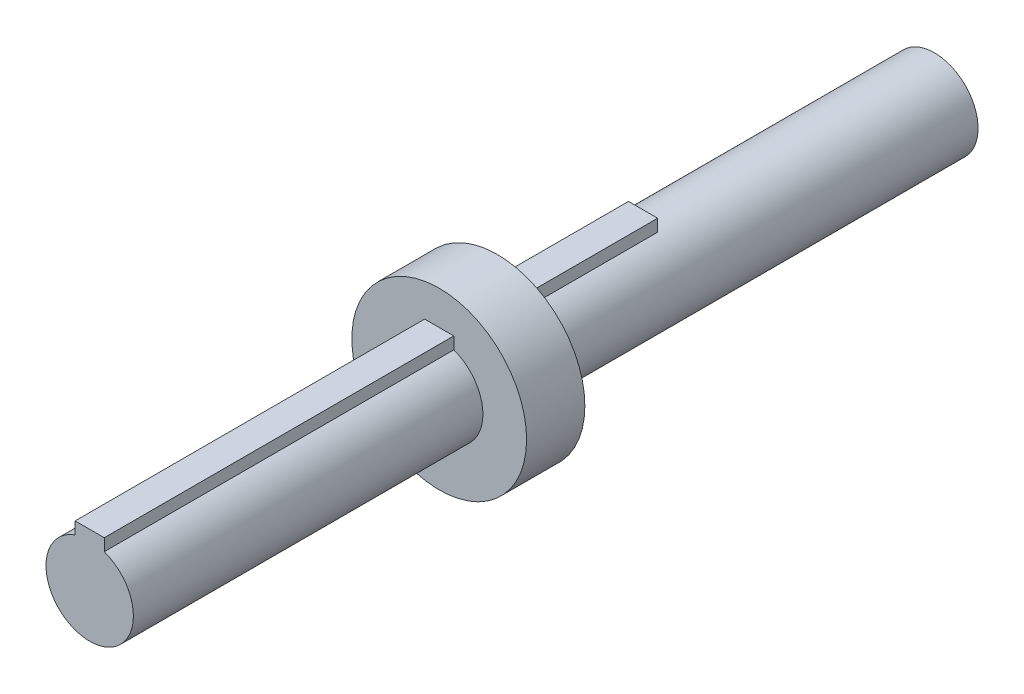
ISO-10303-21;
HEADER;
FILE_DESCRIPTION(('STEP AP214'),'2;1');
FILE_NAME('part.step','',(''),(''),'','','');
FILE_SCHEMA(('AUTOMOTIVE_DESIGN { 1 0 10303 214 1 1 1 1 }'));
ENDSEC;
DATA;
#1=APPLICATION_CONTEXT('core data for automotive mechanical design processes');
#2=APPLICATION_PROTOCOL_DEFINITION('international standard','automotive_design',2000,#1);
#3=PRODUCT_CONTEXT('',#1,'mechanical');
#4=PRODUCT('Part','Part','',(#3));
#5=PRODUCT_RELATED_PRODUCT_CATEGORY('part','',(#4));
#6=PRODUCT_DEFINITION_FORMATION('','',#4);
#7=PRODUCT_DEFINITION_CONTEXT('part definition',#1,'design');
#8=PRODUCT_DEFINITION('design','',#6,#7);
#9=PRODUCT_DEFINITION_SHAPE('','',#8);
#10=(LENGTH_UNIT() NAMED_UNIT(*) SI_UNIT(.MILLI.,.METRE.));
#11=(NAMED_UNIT(*) PLANE_ANGLE_UNIT() SI_UNIT($,.RADIAN.));
#12=(NAMED_UNIT(*) SI_UNIT($,.STERADIAN.) SOLID_ANGLE_UNIT());
#13=UNCERTAINTY_MEASURE_WITH_UNIT(LENGTH_MEASURE(1.E-05),#10,'distance_accuracy_value','');
#14=(GEOMETRIC_REPRESENTATION_CONTEXT(3) GLOBAL_UNCERTAINTY_ASSIGNED_CONTEXT((#13)) GLOBAL_UNIT_ASSIGNED_CONTEXT((#10,
#11,#12)) REPRESENTATION_CONTEXT('',''));
#15=CARTESIAN_POINT('',(0.,0.,0.));
#16=DIRECTION('',(0.,0.,1.));
#17=DIRECTION('',(1.,0.,0.));
#18=AXIS2_PLACEMENT_3D('',#15,#16,#17);
#19=CARTESIAN_POINT('',(0.,0.,800.));
#20=DIRECTION('',(0.,0.,-1.));
#21=DIRECTION('',(-1.,0.,0.));
#22=AXIS2_PLACEMENT_3D('',#19,#20,#21);
#23=CYLINDRICAL_SURFACE('',#22,15.);
#24=CARTESIAN_POINT('',(0.,0.,-900.));
#25=DIRECTION('',(0.,0.,-1.));
#26=DIRECTION('',(-1.,0.,0.));
#27=AXIS2_PLACEMENT_3D('',#24,#25,#26);
#28=CIRCLE('',#27,15.);
#29=CARTESIAN_POINT('',(-15.,0.,-900.));
#30=VERTEX_POINT('',#29);
#31=EDGE_CURVE('E148',#30,#30,#28,.T.);
#32=ORIENTED_EDGE('',*,*,#31,.F.);
#33=EDGE_LOOP('',(#32));
#34=FACE_BOUND('',#33,.T.);
#35=CARTESIAN_POINT('',(0.,0.,-750.));
#36=DIRECTION('',(0.,0.,1.));
#37=DIRECTION('',(1.,0.,0.));
#38=AXIS2_PLACEMENT_3D('',#35,#36,#37);
#39=CIRCLE('',#38,15.);
#40=CARTESIAN_POINT('',(-5.,14.1421356237309,-750.));
#41=VERTEX_POINT('',#40);
#42=CARTESIAN_POINT('',(5.,14.1421356237309,-750.));
#43=VERTEX_POINT('',#42);
#44=EDGE_CURVE('E114',#41,#43,#39,.T.);
#45=ORIENTED_EDGE('',*,*,#44,.F.);
#46=DIRECTION('',(0.,0.,-1.));
#47=VECTOR('',#46,1.);
#48=CARTESIAN_POINT('',(-5.,14.1421356237309,800.));
#49=LINE('',#48,#47);
#50=CARTESIAN_POINT('',(-5.,14.142135623731,-800.));
#51=VERTEX_POINT('',#50);
#52=EDGE_CURVE('E102',#41,#51,#49,.T.);
#53=ORIENTED_EDGE('',*,*,#52,.T.);
#54=CARTESIAN_POINT('',(0.,0.,-800.));
#55=DIRECTION('',(0.,0.,-1.));
#56=DIRECTION('',(-1.,0.,0.));
#57=AXIS2_PLACEMENT_3D('',#54,#55,#56);
#58=CIRCLE('',#57,15.);
#59=CARTESIAN_POINT('',(5.,14.1421356237309,-800.));
#60=VERTEX_POINT('',#59);
#61=EDGE_CURVE('E149',#51,#60,#58,.T.);
#62=ORIENTED_EDGE('',*,*,#61,.T.);
#63=DIRECTION('',(0.,0.,-1.));
#64=VECTOR('',#63,1.);
#65=CARTESIAN_POINT('',(5.,14.1421356237309,800.));
#66=LINE('',#65,#64);
#67=EDGE_CURVE('E115',#43,#60,#66,.T.);
#68=ORIENTED_EDGE('',*,*,#67,.F.);
#69=EDGE_LOOP('',(#45,#53,#62,#68));
#70=FACE_BOUND('',#69,.T.);
#71=ADVANCED_FACE('F37',(#34,#70),#23,.T.);
#72=CARTESIAN_POINT('',(5.,18.3,800.));
#73=DIRECTION('',(-1.,0.,0.));
#74=DIRECTION('',(0.,0.,1.));
#75=AXIS2_PLACEMENT_3D('',#72,#73,#74);
#76=PLANE('',#75);
#77=DIRECTION('',(0.,1.,0.));
#78=VECTOR('',#77,1.);
#79=CARTESIAN_POINT('',(5.,18.3,-750.));
#80=LINE('',#79,#78);
#81=CARTESIAN_POINT('',(5.,18.3,-750.));
#82=VERTEX_POINT('',#81);
#83=EDGE_CURVE('E52',#43,#82,#80,.T.);
#84=ORIENTED_EDGE('',*,*,#83,.F.);
#85=ORIENTED_EDGE('',*,*,#67,.T.);
#86=DIRECTION('',(0.,1.,0.));
#87=VECTOR('',#86,1.);
#88=CARTESIAN_POINT('',(5.,18.3,-800.));
#89=LINE('',#88,#87);
#90=CARTESIAN_POINT('',(5.,18.3,-800.));
#91=VERTEX_POINT('',#90);
#92=EDGE_CURVE('E139',#60,#91,#89,.T.);
#93=ORIENTED_EDGE('',*,*,#92,.T.);
#94=DIRECTION('',(0.,0.,-1.));
#95=VECTOR('',#94,1.);
#96=CARTESIAN_POINT('',(5.,18.3,800.));
#97=LINE('',#96,#95);
#98=EDGE_CURVE('E129',#82,#91,#97,.T.);
#99=ORIENTED_EDGE('',*,*,#98,.F.);
#100=EDGE_LOOP('',(#84,#85,#93,#99));
#101=FACE_BOUND('',#100,.T.);
#102=ADVANCED_FACE('F188',(#101),#76,.F.);
#103=CARTESIAN_POINT('',(-5.,18.3,800.));
#104=DIRECTION('',(0.,-1.,0.));
#105=DIRECTION('',(0.,0.,-1.));
#106=AXIS2_PLACEMENT_3D('',#103,#104,#105);
#107=PLANE('',#106);
#108=DIRECTION('',(-1.,0.,0.));
#109=VECTOR('',#108,1.);
#110=CARTESIAN_POINT('',(-5.,18.3,-750.));
#111=LINE('',#110,#109);
#112=CARTESIAN_POINT('',(-5.,18.3,-750.));
#113=VERTEX_POINT('',#112);
#114=EDGE_CURVE('E60',#82,#113,#111,.T.);
#115=ORIENTED_EDGE('',*,*,#114,.F.);
#116=ORIENTED_EDGE('',*,*,#98,.T.);
#117=DIRECTION('',(-1.,0.,0.));
#118=VECTOR('',#117,1.);
#119=CARTESIAN_POINT('',(-5.,18.3,-800.));
#120=LINE('',#119,#118);
#121=CARTESIAN_POINT('',(-5.,18.3,-800.));
#122=VERTEX_POINT('',#121);
#123=EDGE_CURVE('E136',#91,#122,#120,.T.);
#124=ORIENTED_EDGE('',*,*,#123,.T.);
#125=DIRECTION('',(0.,0.,-1.));
#126=VECTOR('',#125,1.);
#127=CARTESIAN_POINT('',(-5.,18.3,800.));
#128=LINE('',#127,#126);
#129=EDGE_CURVE('E132',#113,#122,#128,.T.);
#130=ORIENTED_EDGE('',*,*,#129,.F.);
#131=EDGE_LOOP('',(#115,#116,#124,#130));
#132=FACE_BOUND('',#131,.T.);
#133=ADVANCED_FACE('F193',(#132),#107,.F.);
#134=CARTESIAN_POINT('',(-5.,14.1421356237309,800.));
#135=DIRECTION('',(1.,0.,0.));
#136=DIRECTION('',(0.,1.,0.));
#137=AXIS2_PLACEMENT_3D('',#134,#135,#136);
#138=PLANE('',#137);
#139=DIRECTION('',(0.,-1.,0.));
#140=VECTOR('',#139,1.);
#141=CARTESIAN_POINT('',(-5.,14.1421356237309,-750.));
#142=LINE('',#141,#140);
#143=EDGE_CURVE('E45',#113,#41,#142,.T.);
#144=ORIENTED_EDGE('',*,*,#143,.F.);
#145=ORIENTED_EDGE('',*,*,#129,.T.);
#146=DIRECTION('',(0.,-1.,0.));
#147=VECTOR('',#146,1.);
#148=CARTESIAN_POINT('',(-5.,14.1421356237309,-800.));
#149=LINE('',#148,#147);
#150=EDGE_CURVE('E107',#122,#51,#149,.T.);
#151=ORIENTED_EDGE('',*,*,#150,.T.);
#152=ORIENTED_EDGE('',*,*,#52,.F.);
#153=EDGE_LOOP('',(#144,#145,#151,#152));
#154=FACE_BOUND('',#153,.T.);
#155=ADVANCED_FACE('F104',(#154),#138,.F.);
#156=CARTESIAN_POINT('',(0.,0.,-800.));
#157=DIRECTION('',(0.,0.,1.));
#158=DIRECTION('',(1.,0.,0.));
#159=AXIS2_PLACEMENT_3D('',#156,#157,#158);
#160=PLANE('',#159);
#161=ORIENTED_EDGE('',*,*,#61,.F.);
#162=ORIENTED_EDGE('',*,*,#150,.F.);
#163=ORIENTED_EDGE('',*,*,#123,.F.);
#164=ORIENTED_EDGE('',*,*,#92,.F.);
#165=EDGE_LOOP('',(#161,#162,#163,#164));
#166=FACE_BOUND('',#165,.T.);
#167=ADVANCED_FACE('F224',(#166),#160,.F.);
#168=CARTESIAN_POINT('',(0.,0.,-900.));
#169=DIRECTION('',(0.,0.,-1.));
#170=DIRECTION('',(-1.,0.,0.));
#171=AXIS2_PLACEMENT_3D('',#168,#169,#170);
#172=PLANE('',#171);
#173=ORIENTED_EDGE('',*,*,#31,.T.);
#174=EDGE_LOOP('',(#173));
#175=FACE_BOUND('',#174,.T.);
#176=ADVANCED_FACE('F185',(#175),#172,.T.);
#177=CARTESIAN_POINT('',(0.,0.,-730.));
#178=DIRECTION('',(0.,0.,1.));
#179=DIRECTION('',(1.,0.,0.));
#180=AXIS2_PLACEMENT_3D('',#177,#178,#179);
#181=PLANE('',#180);
#182=CARTESIAN_POINT('',(0.,0.,-730.));
#183=DIRECTION('',(0.,0.,1.));
#184=DIRECTION('',(1.,0.,0.));
#185=AXIS2_PLACEMENT_3D('',#182,#183,#184);
#186=CIRCLE('',#185,30.);
#187=CARTESIAN_POINT('',(30.,0.,-730.));
#188=VERTEX_POINT('',#187);
#189=EDGE_CURVE('E163',#188,#188,#186,.T.);
#190=ORIENTED_EDGE('',*,*,#189,.T.);
#191=EDGE_LOOP('',(#190));
#192=FACE_BOUND('',#191,.T.);
#193=CARTESIAN_POINT('',(0.,0.,-730.));
#194=DIRECTION('',(0.,0.,1.));
#195=DIRECTION('',(1.,0.,0.));
#196=AXIS2_PLACEMENT_3D('',#193,#194,#195);
#197=CIRCLE('',#196,15.);
#198=CARTESIAN_POINT('',(-5.,14.1421356237309,-730.));
#199=VERTEX_POINT('',#198);
#200=CARTESIAN_POINT('',(5.,14.1421356237309,-730.));
#201=VERTEX_POINT('',#200);
#202=EDGE_CURVE('E151',#199,#201,#197,.T.);
#203=ORIENTED_EDGE('',*,*,#202,.F.);
#204=DIRECTION('',(0.,-1.,0.));
#205=VECTOR('',#204,1.);
#206=CARTESIAN_POINT('',(-5.,14.1421356237309,-730.));
#207=LINE('',#206,#205);
#208=CARTESIAN_POINT('',(-5.,18.3,-730.));
#209=VERTEX_POINT('',#208);
#210=EDGE_CURVE('E11',#209,#199,#207,.T.);
#211=ORIENTED_EDGE('',*,*,#210,.F.);
#212=DIRECTION('',(-1.,0.,0.));
#213=VECTOR('',#212,1.);
#214=CARTESIAN_POINT('',(-5.,18.3,-730.));
#215=LINE('',#214,#213);
#216=CARTESIAN_POINT('',(5.,18.3,-730.));
#217=VERTEX_POINT('',#216);
#218=EDGE_CURVE('E117',#217,#209,#215,.T.);
#219=ORIENTED_EDGE('',*,*,#218,.F.);
#220=DIRECTION('',(0.,1.,0.));
#221=VECTOR('',#220,1.);
#222=CARTESIAN_POINT('',(5.,18.3,-730.));
#223=LINE('',#222,#221);
#224=EDGE_CURVE('E156',#201,#217,#223,.T.);
#225=ORIENTED_EDGE('',*,*,#224,.F.);
#226=EDGE_LOOP('',(#203,#211,#219,#225));
#227=FACE_BOUND('',#226,.T.);
#228=ADVANCED_FACE('F170',(#192,#227),#181,.T.);
#229=CARTESIAN_POINT('',(0.,0.,-750.));
#230=DIRECTION('',(0.,0.,1.));
#231=DIRECTION('',(1.,0.,0.));
#232=AXIS2_PLACEMENT_3D('',#229,#230,#231);
#233=PLANE('',#232);
#234=CARTESIAN_POINT('',(0.,0.,-750.));
#235=DIRECTION('',(0.,0.,1.));
#236=DIRECTION('',(1.,0.,0.));
#237=AXIS2_PLACEMENT_3D('',#234,#235,#236);
#238=CIRCLE('',#237,30.);
#239=CARTESIAN_POINT('',(30.,0.,-750.));
#240=VERTEX_POINT('',#239);
#241=EDGE_CURVE('E164',#240,#240,#238,.T.);
#242=ORIENTED_EDGE('',*,*,#241,.F.);
#243=EDGE_LOOP('',(#242));
#244=FACE_BOUND('',#243,.T.);
#245=ORIENTED_EDGE('',*,*,#143,.T.);
#246=ORIENTED_EDGE('',*,*,#44,.T.);
#247=ORIENTED_EDGE('',*,*,#83,.T.);
#248=ORIENTED_EDGE('',*,*,#114,.T.);
#249=EDGE_LOOP('',(#245,#246,#247,#248));
#250=FACE_BOUND('',#249,.T.);
#251=ADVANCED_FACE('F119',(#244,#250),#233,.F.);
#252=CARTESIAN_POINT('',(0.,0.,-730.));
#253=DIRECTION('',(0.,0.,-1.));
#254=DIRECTION('',(-1.,0.,0.));
#255=AXIS2_PLACEMENT_3D('',#252,#253,#254);
#256=CYLINDRICAL_SURFACE('',#255,30.);
#257=ORIENTED_EDGE('',*,*,#189,.F.);
#258=EDGE_LOOP('',(#257));
#259=FACE_BOUND('',#258,.T.);
#260=ORIENTED_EDGE('',*,*,#241,.T.);
#261=EDGE_LOOP('',(#260));
#262=FACE_BOUND('',#261,.T.);
#263=ADVANCED_FACE('F173',(#259,#262),#256,.T.);
#264=CARTESIAN_POINT('',(0.,0.,-610.));
#265=DIRECTION('',(0.,0.,1.));
#266=DIRECTION('',(1.,0.,0.));
#267=AXIS2_PLACEMENT_3D('',#264,#265,#266);
#268=PLANE('',#267);
#269=CARTESIAN_POINT('',(0.,0.,-610.));
#270=DIRECTION('',(0.,0.,1.));
#271=DIRECTION('',(1.,0.,0.));
#272=AXIS2_PLACEMENT_3D('',#269,#270,#271);
#273=CIRCLE('',#272,15.);
#274=CARTESIAN_POINT('',(-5.,14.1421356237309,-610.));
#275=VERTEX_POINT('',#274);
#276=CARTESIAN_POINT('',(5.,14.1421356237309,-610.));
#277=VERTEX_POINT('',#276);
#278=EDGE_CURVE('E120',#275,#277,#273,.T.);
#279=ORIENTED_EDGE('',*,*,#278,.T.);
#280=DIRECTION('',(0.,1.,0.));
#281=VECTOR('',#280,1.);
#282=CARTESIAN_POINT('',(5.,18.3,-610.));
#283=LINE('',#282,#281);
#284=CARTESIAN_POINT('',(5.,18.3,-610.));
#285=VERTEX_POINT('',#284);
#286=EDGE_CURVE('E146',#277,#285,#283,.T.);
#287=ORIENTED_EDGE('',*,*,#286,.T.);
#288=DIRECTION('',(-1.,0.,0.));
#289=VECTOR('',#288,1.);
#290=CARTESIAN_POINT('',(-5.,18.3,-610.));
#291=LINE('',#290,#289);
#292=CARTESIAN_POINT('',(-5.,18.3,-610.));
#293=VERTEX_POINT('',#292);
#294=EDGE_CURVE('E144',#285,#293,#291,.T.);
#295=ORIENTED_EDGE('',*,*,#294,.T.);
#296=DIRECTION('',(0.,-1.,0.));
#297=VECTOR('',#296,1.);
#298=CARTESIAN_POINT('',(-5.,14.1421356237309,-610.));
#299=LINE('',#298,#297);
#300=EDGE_CURVE('E142',#293,#275,#299,.T.);
#301=ORIENTED_EDGE('',*,*,#300,.T.);
#302=EDGE_LOOP('',(#279,#287,#295,#301));
#303=FACE_BOUND('',#302,.T.);
#304=ADVANCED_FACE('F176',(#303),#268,.T.);
#305=EDGE_CURVE('E130',#293,#209,#128,.T.);
#306=ORIENTED_EDGE('',*,*,#305,.T.);
#307=ORIENTED_EDGE('',*,*,#210,.T.);
#308=EDGE_CURVE('E111',#275,#199,#49,.T.);
#309=ORIENTED_EDGE('',*,*,#308,.F.);
#310=ORIENTED_EDGE('',*,*,#300,.F.);
#311=EDGE_LOOP('',(#306,#307,#309,#310));
#312=FACE_BOUND('',#311,.T.);
#313=ADVANCED_FACE('F208',(#312),#138,.F.);
#314=EDGE_CURVE('E126',#285,#217,#97,.T.);
#315=ORIENTED_EDGE('',*,*,#314,.T.);
#316=ORIENTED_EDGE('',*,*,#218,.T.);
#317=ORIENTED_EDGE('',*,*,#305,.F.);
#318=ORIENTED_EDGE('',*,*,#294,.F.);
#319=EDGE_LOOP('',(#315,#316,#317,#318));
#320=FACE_BOUND('',#319,.T.);
#321=ADVANCED_FACE('F201',(#320),#107,.F.);
#322=EDGE_CURVE('E121',#277,#201,#66,.T.);
#323=ORIENTED_EDGE('',*,*,#322,.T.);
#324=ORIENTED_EDGE('',*,*,#224,.T.);
#325=ORIENTED_EDGE('',*,*,#314,.F.);
#326=ORIENTED_EDGE('',*,*,#286,.F.);
#327=EDGE_LOOP('',(#323,#324,#325,#326));
#328=FACE_BOUND('',#327,.T.);
#329=ADVANCED_FACE('F194',(#328),#76,.F.);
#330=ORIENTED_EDGE('',*,*,#308,.T.);
#331=ORIENTED_EDGE('',*,*,#202,.T.);
#332=ORIENTED_EDGE('',*,*,#322,.F.);
#333=ORIENTED_EDGE('',*,*,#278,.F.);
#334=EDGE_LOOP('',(#330,#331,#332,#333));
#335=FACE_BOUND('',#334,.T.);
#336=ADVANCED_FACE('F39',(#335),#23,.T.);
#337=CLOSED_SHELL('',(#71,#102,#133,#155,#167,#176,#228,#251,#263,#304,#313,#321,#329,#336));
#338=MANIFOLD_SOLID_BREP('B2',#337);
#339=ADVANCED_BREP_SHAPE_REPRESENTATION('',(#18,#338),#14);
#340=SHAPE_DEFINITION_REPRESENTATION(#9,#339);
ENDSEC;
END-ISO-10303-21;
